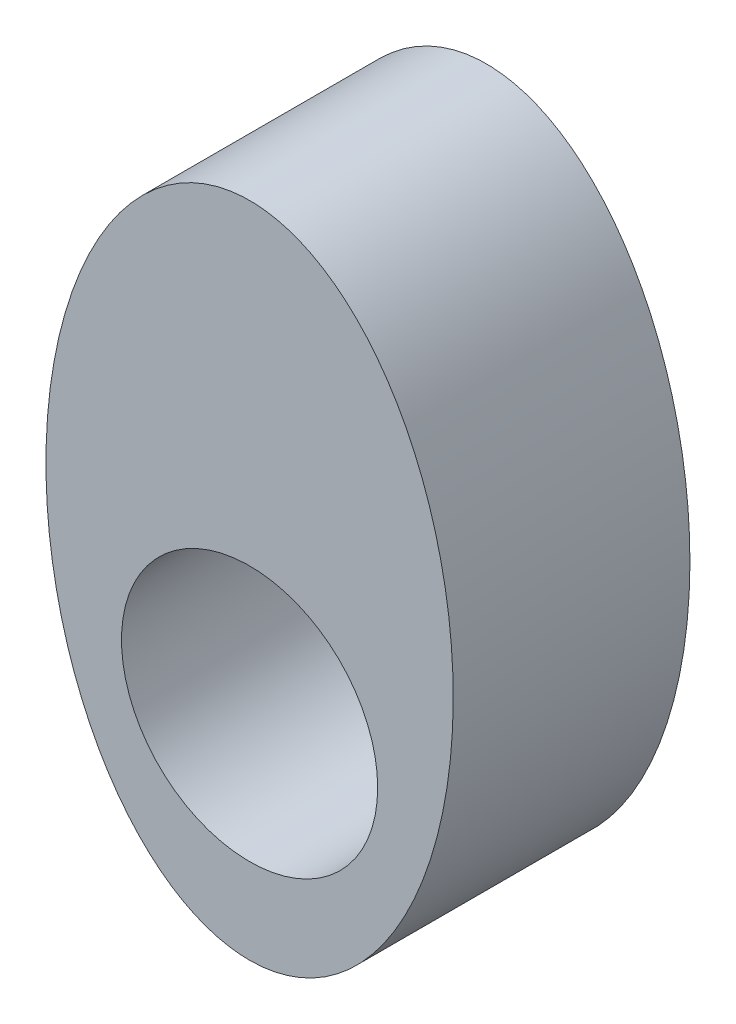
ISO-10303-21;
HEADER;
FILE_DESCRIPTION(('STEP AP214'),'2;1');
FILE_NAME('part.step','',(''),(''),'','','');
FILE_SCHEMA(('AUTOMOTIVE_DESIGN { 1 0 10303 214 1 1 1 1 }'));
ENDSEC;
DATA;
#1=APPLICATION_CONTEXT('core data for automotive mechanical design processes');
#2=APPLICATION_PROTOCOL_DEFINITION('international standard','automotive_design',2000,#1);
#3=PRODUCT_CONTEXT('',#1,'mechanical');
#4=PRODUCT('Part','Part','',(#3));
#5=PRODUCT_RELATED_PRODUCT_CATEGORY('part','',(#4));
#6=PRODUCT_DEFINITION_FORMATION('','',#4);
#7=PRODUCT_DEFINITION_CONTEXT('part definition',#1,'design');
#8=PRODUCT_DEFINITION('design','',#6,#7);
#9=PRODUCT_DEFINITION_SHAPE('','',#8);
#10=(LENGTH_UNIT() NAMED_UNIT(*) SI_UNIT(.MILLI.,.METRE.));
#11=(NAMED_UNIT(*) PLANE_ANGLE_UNIT() SI_UNIT($,.RADIAN.));
#12=(NAMED_UNIT(*) SI_UNIT($,.STERADIAN.) SOLID_ANGLE_UNIT());
#13=UNCERTAINTY_MEASURE_WITH_UNIT(LENGTH_MEASURE(1.E-05),#10,'distance_accuracy_value','');
#14=(GEOMETRIC_REPRESENTATION_CONTEXT(3) GLOBAL_UNCERTAINTY_ASSIGNED_CONTEXT((#13)) GLOBAL_UNIT_ASSIGNED_CONTEXT((#10,
#11,#12)) REPRESENTATION_CONTEXT('',''));
#15=CARTESIAN_POINT('',(0.,0.,0.));
#16=DIRECTION('',(0.,0.,1.));
#17=DIRECTION('',(1.,0.,0.));
#18=AXIS2_PLACEMENT_3D('',#15,#16,#17);
#19=CARTESIAN_POINT('',(0.,4.29525856439091,8.80000018));
#20=DIRECTION('',(0.,0.,1.));
#21=DIRECTION('',(1.,0.,0.));
#22=AXIS2_PLACEMENT_3D('',#19,#20,#21);
#23=PLANE('',#22);
#24=CARTESIAN_POINT('',(0.,4.29525856439091,8.80000018));
#25=DIRECTION('',(0.,0.,1.));
#26=DIRECTION('',(0.,-1.,0.));
#27=AXIS2_PLACEMENT_3D('',#24,#25,#26);
#28=ELLIPSE('',#27,12.2327585643909,7.57107870142624);
#29=CARTESIAN_POINT('',(0.,-7.9375,8.80000018));
#30=VERTEX_POINT('',#29);
#31=EDGE_CURVE('E11',#30,#30,#28,.T.);
#32=ORIENTED_EDGE('',*,*,#31,.T.);
#33=EDGE_LOOP('',(#32));
#34=FACE_BOUND('',#33,.T.);
#35=CARTESIAN_POINT('',(0.,0.,8.80000018));
#36=DIRECTION('',(0.,0.,1.));
#37=DIRECTION('',(1.,0.,0.));
#38=AXIS2_PLACEMENT_3D('',#35,#36,#37);
#39=CIRCLE('',#38,4.7625);
#40=CARTESIAN_POINT('',(4.7625,0.,8.80000018));
#41=VERTEX_POINT('',#40);
#42=EDGE_CURVE('E48',#41,#41,#39,.T.);
#43=ORIENTED_EDGE('',*,*,#42,.F.);
#44=EDGE_LOOP('',(#43));
#45=FACE_BOUND('',#44,.T.);
#46=ADVANCED_FACE('F37',(#34,#45),#23,.T.);
#47=CARTESIAN_POINT('',(0.,4.29525856439091,0.));
#48=DIRECTION('',(0.,0.,1.));
#49=DIRECTION('',(1.,0.,0.));
#50=AXIS2_PLACEMENT_3D('',#47,#48,#49);
#51=PLANE('',#50);
#52=CARTESIAN_POINT('',(0.,4.29525856439091,0.));
#53=DIRECTION('',(0.,0.,1.));
#54=DIRECTION('',(0.,-1.,0.));
#55=AXIS2_PLACEMENT_3D('',#52,#53,#54);
#56=ELLIPSE('',#55,12.2327585643909,7.57107870142624);
#57=CARTESIAN_POINT('',(0.,-7.9375,0.));
#58=VERTEX_POINT('',#57);
#59=EDGE_CURVE('E42',#58,#58,#56,.T.);
#60=ORIENTED_EDGE('',*,*,#59,.F.);
#61=EDGE_LOOP('',(#60));
#62=FACE_BOUND('',#61,.T.);
#63=CARTESIAN_POINT('',(0.,0.,0.));
#64=DIRECTION('',(0.,0.,1.));
#65=DIRECTION('',(1.,0.,0.));
#66=AXIS2_PLACEMENT_3D('',#63,#64,#65);
#67=CIRCLE('',#66,4.7625);
#68=CARTESIAN_POINT('',(4.7625,0.,0.));
#69=VERTEX_POINT('',#68);
#70=EDGE_CURVE('E51',#69,#69,#67,.T.);
#71=ORIENTED_EDGE('',*,*,#70,.T.);
#72=EDGE_LOOP('',(#71));
#73=FACE_BOUND('',#72,.T.);
#74=ADVANCED_FACE('F61',(#62,#73),#51,.F.);
#75=DIRECTION('',(0.,0.,-1.));
#76=VECTOR('',#75,1.);
#77=SURFACE_OF_LINEAR_EXTRUSION('',#28,#76);
#78=ORIENTED_EDGE('',*,*,#31,.F.);
#79=EDGE_LOOP('',(#78));
#80=FACE_BOUND('',#79,.T.);
#81=ORIENTED_EDGE('',*,*,#59,.T.);
#82=EDGE_LOOP('',(#81));
#83=FACE_BOUND('',#82,.T.);
#84=ADVANCED_FACE('F39',(#80,#83),#77,.F.);
#85=CARTESIAN_POINT('',(0.,0.,8.80000018));
#86=DIRECTION('',(0.,0.,-1.));
#87=DIRECTION('',(-1.,0.,0.));
#88=AXIS2_PLACEMENT_3D('',#85,#86,#87);
#89=CYLINDRICAL_SURFACE('',#88,4.7625);
#90=ORIENTED_EDGE('',*,*,#42,.T.);
#91=EDGE_LOOP('',(#90));
#92=FACE_BOUND('',#91,.T.);
#93=ORIENTED_EDGE('',*,*,#70,.F.);
#94=EDGE_LOOP('',(#93));
#95=FACE_BOUND('',#94,.T.);
#96=ADVANCED_FACE('F57',(#92,#95),#89,.F.);
#97=CLOSED_SHELL('',(#46,#74,#84,#96));
#98=MANIFOLD_SOLID_BREP('B2',#97);
#99=ADVANCED_BREP_SHAPE_REPRESENTATION('',(#18,#98),#14);
#100=SHAPE_DEFINITION_REPRESENTATION(#9,#99);
ENDSEC;
END-ISO-10303-21;
